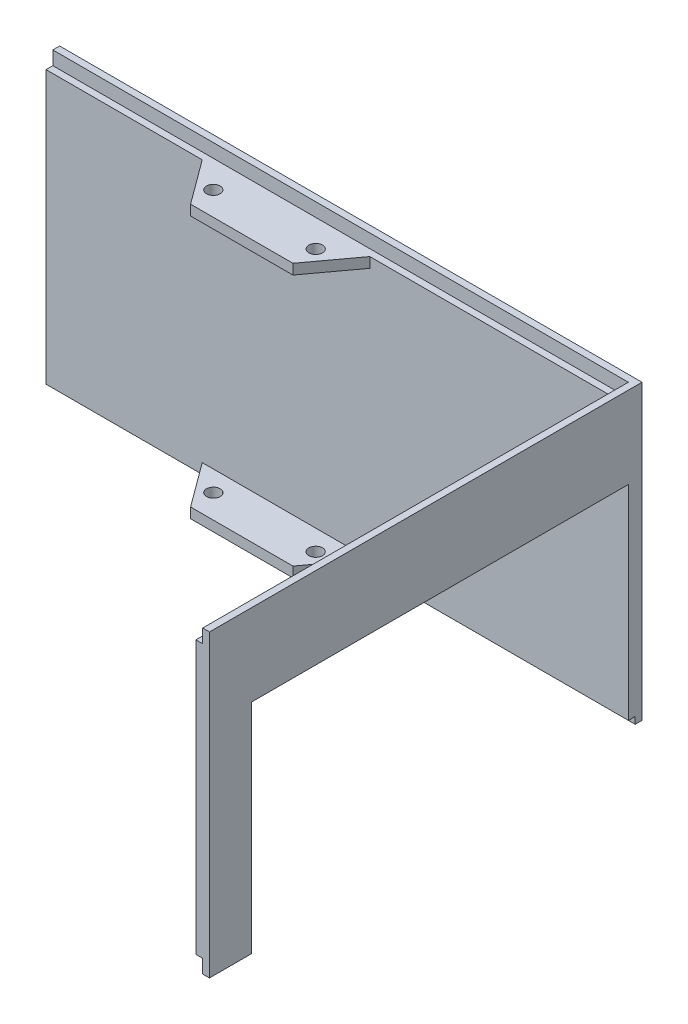
ISO-10303-21;
HEADER;
FILE_DESCRIPTION(('STEP AP214'),'2;1');
FILE_NAME('part.step','',(''),(''),'','','');
FILE_SCHEMA(('AUTOMOTIVE_DESIGN { 1 0 10303 214 1 1 1 1 }'));
ENDSEC;
DATA;
#1=APPLICATION_CONTEXT('core data for automotive mechanical design processes');
#2=APPLICATION_PROTOCOL_DEFINITION('international standard','automotive_design',2000,#1);
#3=PRODUCT_CONTEXT('',#1,'mechanical');
#4=PRODUCT('Part','Part','',(#3));
#5=PRODUCT_RELATED_PRODUCT_CATEGORY('part','',(#4));
#6=PRODUCT_DEFINITION_FORMATION('','',#4);
#7=PRODUCT_DEFINITION_CONTEXT('part definition',#1,'design');
#8=PRODUCT_DEFINITION('design','',#6,#7);
#9=PRODUCT_DEFINITION_SHAPE('','',#8);
#10=(LENGTH_UNIT() NAMED_UNIT(*) SI_UNIT(.MILLI.,.METRE.));
#11=(NAMED_UNIT(*) PLANE_ANGLE_UNIT() SI_UNIT($,.RADIAN.));
#12=(NAMED_UNIT(*) SI_UNIT($,.STERADIAN.) SOLID_ANGLE_UNIT());
#13=UNCERTAINTY_MEASURE_WITH_UNIT(LENGTH_MEASURE(1.E-05),#10,'distance_accuracy_value','');
#14=(GEOMETRIC_REPRESENTATION_CONTEXT(3) GLOBAL_UNCERTAINTY_ASSIGNED_CONTEXT((#13)) GLOBAL_UNIT_ASSIGNED_CONTEXT((#10,
#11,#12)) REPRESENTATION_CONTEXT('',''));
#15=CARTESIAN_POINT('',(0.,0.,0.));
#16=DIRECTION('',(0.,0.,1.));
#17=DIRECTION('',(1.,0.,0.));
#18=AXIS2_PLACEMENT_3D('',#15,#16,#17);
#19=CARTESIAN_POINT('',(0.,0.,4.));
#20=DIRECTION('',(0.,0.,1.));
#21=DIRECTION('',(1.,0.,0.));
#22=AXIS2_PLACEMENT_3D('',#19,#20,#21);
#23=PLANE('',#22);
#24=DIRECTION('',(0.,1.,0.));
#25=VECTOR('',#24,1.);
#26=CARTESIAN_POINT('',(9.57742396503259,36.,4.));
#27=LINE('',#26,#25);
#28=CARTESIAN_POINT('',(9.57742396503259,36.,4.));
#29=VERTEX_POINT('',#28);
#30=CARTESIAN_POINT('',(9.57742396503259,39.,4.));
#31=VERTEX_POINT('',#30);
#32=EDGE_CURVE('E230',#29,#31,#27,.T.);
#33=ORIENTED_EDGE('',*,*,#32,.F.);
#34=DIRECTION('',(-1.,0.,0.));
#35=VECTOR('',#34,1.);
#36=CARTESIAN_POINT('',(0.,36.,4.));
#37=LINE('',#36,#35);
#38=CARTESIAN_POINT('',(-39.6274239650326,36.,4.));
#39=VERTEX_POINT('',#38);
#40=EDGE_CURVE('E215',#29,#39,#37,.T.);
#41=ORIENTED_EDGE('',*,*,#40,.T.);
#42=DIRECTION('',(0.,1.,0.));
#43=VECTOR('',#42,1.);
#44=CARTESIAN_POINT('',(-39.6274239650326,36.,4.));
#45=LINE('',#44,#43);
#46=CARTESIAN_POINT('',(-39.6274239650326,39.,4.));
#47=VERTEX_POINT('',#46);
#48=EDGE_CURVE('E239',#39,#47,#45,.T.);
#49=ORIENTED_EDGE('',*,*,#48,.T.);
#50=DIRECTION('',(1.,0.,0.));
#51=VECTOR('',#50,1.);
#52=CARTESIAN_POINT('',(0.,39.,4.));
#53=LINE('',#52,#51);
#54=CARTESIAN_POINT('',(-85.5,39.,4.));
#55=VERTEX_POINT('',#54);
#56=EDGE_CURVE('E463',#55,#47,#53,.T.);
#57=ORIENTED_EDGE('',*,*,#56,.F.);
#58=DIRECTION('',(0.,1.,0.));
#59=VECTOR('',#58,1.);
#60=CARTESIAN_POINT('',(-85.5,0.,4.));
#61=LINE('',#60,#59);
#62=CARTESIAN_POINT('',(-85.5,-41.,4.));
#63=VERTEX_POINT('',#62);
#64=EDGE_CURVE('E451',#63,#55,#61,.T.);
#65=ORIENTED_EDGE('',*,*,#64,.F.);
#66=DIRECTION('',(1.,0.,0.));
#67=VECTOR('',#66,1.);
#68=CARTESIAN_POINT('',(0.,-41.,4.));
#69=LINE('',#68,#67);
#70=CARTESIAN_POINT('',(-39.6274239650326,-41.,4.));
#71=VERTEX_POINT('',#70);
#72=EDGE_CURVE('E457',#63,#71,#69,.T.);
#73=ORIENTED_EDGE('',*,*,#72,.T.);
#74=DIRECTION('',(0.,-1.,0.));
#75=VECTOR('',#74,1.);
#76=CARTESIAN_POINT('',(-39.6274239650326,-38.,4.));
#77=LINE('',#76,#75);
#78=CARTESIAN_POINT('',(-39.6274239650326,-38.,4.));
#79=VERTEX_POINT('',#78);
#80=EDGE_CURVE('E293',#79,#71,#77,.T.);
#81=ORIENTED_EDGE('',*,*,#80,.F.);
#82=DIRECTION('',(-1.,0.,0.));
#83=VECTOR('',#82,1.);
#84=CARTESIAN_POINT('',(0.,-38.,4.));
#85=LINE('',#84,#83);
#86=CARTESIAN_POINT('',(9.57742396503259,-38.,4.));
#87=VERTEX_POINT('',#86);
#88=EDGE_CURVE('E75',#87,#79,#85,.T.);
#89=ORIENTED_EDGE('',*,*,#88,.F.);
#90=DIRECTION('',(0.,-1.,0.));
#91=VECTOR('',#90,1.);
#92=CARTESIAN_POINT('',(9.57742396503259,-38.,4.));
#93=LINE('',#92,#91);
#94=CARTESIAN_POINT('',(9.57742396503259,-41.,4.));
#95=VERTEX_POINT('',#94);
#96=EDGE_CURVE('E289',#87,#95,#93,.T.);
#97=ORIENTED_EDGE('',*,*,#96,.T.);
#98=CARTESIAN_POINT('',(85.5,-41.,4.));
#99=VERTEX_POINT('',#98);
#100=EDGE_CURVE('E455',#95,#99,#69,.T.);
#101=ORIENTED_EDGE('',*,*,#100,.T.);
#102=DIRECTION('',(0.,1.,0.));
#103=VECTOR('',#102,1.);
#104=CARTESIAN_POINT('',(85.5,0.,4.));
#105=LINE('',#104,#103);
#106=CARTESIAN_POINT('',(85.5,19.,4.));
#107=VERTEX_POINT('',#106);
#108=EDGE_CURVE('E460',#99,#107,#105,.T.);
#109=ORIENTED_EDGE('',*,*,#108,.T.);
#110=DIRECTION('',(1.,0.,0.));
#111=VECTOR('',#110,1.);
#112=CARTESIAN_POINT('',(81.5,19.,4.));
#113=LINE('',#112,#111);
#114=CARTESIAN_POINT('',(81.5,19.,4.));
#115=VERTEX_POINT('',#114);
#116=EDGE_CURVE('E392',#115,#107,#113,.T.);
#117=ORIENTED_EDGE('',*,*,#116,.F.);
#118=DIRECTION('',(0.,-1.,0.));
#119=VECTOR('',#118,1.);
#120=CARTESIAN_POINT('',(81.5,0.,4.));
#121=LINE('',#120,#119);
#122=CARTESIAN_POINT('',(81.5,39.,4.));
#123=VERTEX_POINT('',#122);
#124=EDGE_CURVE('E362',#123,#115,#121,.T.);
#125=ORIENTED_EDGE('',*,*,#124,.F.);
#126=EDGE_CURVE('E237',#31,#123,#53,.T.);
#127=ORIENTED_EDGE('',*,*,#126,.F.);
#128=EDGE_LOOP('',(#33,#41,#49,#57,#65,#73,#81,#89,#97,#101,#109,#117,#125,#127));
#129=FACE_BOUND('',#128,.T.);
#130=ADVANCED_FACE('F51',(#129),#23,.T.);
#131=CARTESIAN_POINT('',(81.5,-41.,0.));
#132=DIRECTION('',(0.,-1.,0.));
#133=DIRECTION('',(0.,0.,-1.));
#134=AXIS2_PLACEMENT_3D('',#131,#132,#133);
#135=PLANE('',#134);
#136=DIRECTION('',(1.,0.,0.));
#137=VECTOR('',#136,1.);
#138=CARTESIAN_POINT('',(81.5,-41.,114.644000153735));
#139=LINE('',#138,#137);
#140=CARTESIAN_POINT('',(81.5,-41.,114.644000153735));
#141=VERTEX_POINT('',#140);
#142=CARTESIAN_POINT('',(83.5,-41.,114.644000153735));
#143=VERTEX_POINT('',#142);
#144=EDGE_CURVE('E373',#141,#143,#139,.T.);
#145=ORIENTED_EDGE('',*,*,#144,.T.);
#146=DIRECTION('',(0.,0.,-1.));
#147=VECTOR('',#146,1.);
#148=CARTESIAN_POINT('',(83.5,-41.,0.));
#149=LINE('',#148,#147);
#150=CARTESIAN_POINT('',(83.5,-41.,127.));
#151=VERTEX_POINT('',#150);
#152=EDGE_CURVE('E314',#151,#143,#149,.T.);
#153=ORIENTED_EDGE('',*,*,#152,.F.);
#154=DIRECTION('',(1.,0.,0.));
#155=VECTOR('',#154,1.);
#156=CARTESIAN_POINT('',(81.5,-41.,127.));
#157=LINE('',#156,#155);
#158=CARTESIAN_POINT('',(81.5,-41.,127.));
#159=VERTEX_POINT('',#158);
#160=EDGE_CURVE('E384',#159,#151,#157,.T.);
#161=ORIENTED_EDGE('',*,*,#160,.F.);
#162=DIRECTION('',(0.,0.,-1.));
#163=VECTOR('',#162,1.);
#164=CARTESIAN_POINT('',(81.5,-41.,0.));
#165=LINE('',#164,#163);
#166=EDGE_CURVE('E349',#159,#141,#165,.T.);
#167=ORIENTED_EDGE('',*,*,#166,.T.);
#168=EDGE_LOOP('',(#145,#153,#161,#167));
#169=FACE_BOUND('',#168,.T.);
#170=ADVANCED_FACE('F566',(#169),#135,.T.);
#171=CARTESIAN_POINT('',(0.,39.,4.));
#172=DIRECTION('',(0.,1.,0.));
#173=DIRECTION('',(0.,0.,1.));
#174=AXIS2_PLACEMENT_3D('',#171,#172,#173);
#175=PLANE('',#174);
#176=CARTESIAN_POINT('',(-0.300000000000009,39.,10.02));
#177=DIRECTION('',(0.,1.,0.));
#178=DIRECTION('',(0.,0.,1.));
#179=AXIS2_PLACEMENT_3D('',#176,#177,#178);
#180=CIRCLE('',#179,2.);
#181=CARTESIAN_POINT('',(-0.300000000000009,39.,12.02));
#182=VERTEX_POINT('',#181);
#183=EDGE_CURVE('E540',#182,#182,#180,.T.);
#184=ORIENTED_EDGE('',*,*,#183,.F.);
#185=EDGE_LOOP('',(#184));
#186=FACE_BOUND('',#185,.T.);
#187=CARTESIAN_POINT('',(-30.35,39.,10.02));
#188=DIRECTION('',(0.,1.,0.));
#189=DIRECTION('',(0.,0.,1.));
#190=AXIS2_PLACEMENT_3D('',#187,#188,#189);
#191=CIRCLE('',#190,2.);
#192=CARTESIAN_POINT('',(-30.35,39.,12.02));
#193=VERTEX_POINT('',#192);
#194=EDGE_CURVE('E548',#193,#193,#191,.T.);
#195=ORIENTED_EDGE('',*,*,#194,.F.);
#196=EDGE_LOOP('',(#195));
#197=FACE_BOUND('',#196,.T.);
#198=DIRECTION('',(1.,0.,0.));
#199=VECTOR('',#198,1.);
#200=CARTESIAN_POINT('',(81.5,39.,127.));
#201=LINE('',#200,#199);
#202=CARTESIAN_POINT('',(81.5,39.,127.));
#203=VERTEX_POINT('',#202);
#204=CARTESIAN_POINT('',(83.5,39.,127.));
#205=VERTEX_POINT('',#204);
#206=EDGE_CURVE('E389',#203,#205,#201,.T.);
#207=ORIENTED_EDGE('',*,*,#206,.T.);
#208=DIRECTION('',(0.,0.,1.));
#209=VECTOR('',#208,1.);
#210=CARTESIAN_POINT('',(83.5,39.,0.));
#211=LINE('',#210,#209);
#212=CARTESIAN_POINT('',(83.5,39.,2.));
#213=VERTEX_POINT('',#212);
#214=EDGE_CURVE('E326',#213,#205,#211,.T.);
#215=ORIENTED_EDGE('',*,*,#214,.F.);
#216=DIRECTION('',(1.,0.,0.));
#217=VECTOR('',#216,1.);
#218=CARTESIAN_POINT('',(0.,39.,2.));
#219=LINE('',#218,#217);
#220=CARTESIAN_POINT('',(-85.5,39.,2.));
#221=VERTEX_POINT('',#220);
#222=EDGE_CURVE('E432',#221,#213,#219,.T.);
#223=ORIENTED_EDGE('',*,*,#222,.F.);
#224=DIRECTION('',(0.,0.,-1.));
#225=VECTOR('',#224,1.);
#226=CARTESIAN_POINT('',(-85.5,39.,4.));
#227=LINE('',#226,#225);
#228=EDGE_CURVE('E467',#55,#221,#227,.T.);
#229=ORIENTED_EDGE('',*,*,#228,.F.);
#230=ORIENTED_EDGE('',*,*,#56,.T.);
#231=DIRECTION('',(-0.59313788951841,0.,-0.805100890583066));
#232=VECTOR('',#231,1.);
#233=CARTESIAN_POINT('',(-27.5961420252574,39.,20.3307655365495));
#234=LINE('',#233,#232);
#235=CARTESIAN_POINT('',(-30.05,39.,17.));
#236=VERTEX_POINT('',#235);
#237=EDGE_CURVE('E536',#236,#47,#234,.T.);
#238=ORIENTED_EDGE('',*,*,#237,.F.);
#239=DIRECTION('',(1.,0.,0.));
#240=VECTOR('',#239,1.);
#241=CARTESIAN_POINT('',(0.,39.,17.));
#242=LINE('',#241,#240);
#243=CARTESIAN_POINT('',(0.,39.,17.));
#244=VERTEX_POINT('',#243);
#245=EDGE_CURVE('E234',#236,#244,#242,.T.);
#246=ORIENTED_EDGE('',*,*,#245,.T.);
#247=DIRECTION('',(0.593137889518411,0.,-0.805100890583065));
#248=VECTOR('',#247,1.);
#249=CARTESIAN_POINT('',(8.11810933252715,39.,5.98081345170003));
#250=LINE('',#249,#248);
#251=EDGE_CURVE('E67',#244,#31,#250,.T.);
#252=ORIENTED_EDGE('',*,*,#251,.T.);
#253=ORIENTED_EDGE('',*,*,#126,.T.);
#254=DIRECTION('',(0.,0.,1.));
#255=VECTOR('',#254,1.);
#256=CARTESIAN_POINT('',(81.5,39.,0.));
#257=LINE('',#256,#255);
#258=EDGE_CURVE('E366',#123,#203,#257,.T.);
#259=ORIENTED_EDGE('',*,*,#258,.T.);
#260=EDGE_LOOP('',(#207,#215,#223,#229,#230,#238,#246,#252,#253,#259));
#261=FACE_BOUND('',#260,.T.);
#262=ADVANCED_FACE('F525',(#186,#197,#261),#175,.T.);
#263=CARTESIAN_POINT('',(0.,0.,2.));
#264=DIRECTION('',(0.,0.,1.));
#265=DIRECTION('',(1.,0.,0.));
#266=AXIS2_PLACEMENT_3D('',#263,#264,#265);
#267=PLANE('',#266);
#268=ORIENTED_EDGE('',*,*,#222,.T.);
#269=DIRECTION('',(0.,-1.,0.));
#270=VECTOR('',#269,1.);
#271=CARTESIAN_POINT('',(83.5,0.,2.));
#272=LINE('',#271,#270);
#273=CARTESIAN_POINT('',(83.5,43.,2.));
#274=VERTEX_POINT('',#273);
#275=EDGE_CURVE('E333',#274,#213,#272,.T.);
#276=ORIENTED_EDGE('',*,*,#275,.F.);
#277=DIRECTION('',(-1.,0.,0.));
#278=VECTOR('',#277,1.);
#279=CARTESIAN_POINT('',(0.,43.,2.));
#280=LINE('',#279,#278);
#281=CARTESIAN_POINT('',(-85.5,43.,2.));
#282=VERTEX_POINT('',#281);
#283=EDGE_CURVE('E436',#274,#282,#280,.T.);
#284=ORIENTED_EDGE('',*,*,#283,.T.);
#285=DIRECTION('',(0.,1.,0.));
#286=VECTOR('',#285,1.);
#287=CARTESIAN_POINT('',(-85.5,0.,2.));
#288=LINE('',#287,#286);
#289=EDGE_CURVE('E428',#221,#282,#288,.T.);
#290=ORIENTED_EDGE('',*,*,#289,.F.);
#291=EDGE_LOOP('',(#268,#276,#284,#290));
#292=FACE_BOUND('',#291,.T.);
#293=ADVANCED_FACE('F565',(#292),#267,.T.);
#294=CARTESIAN_POINT('',(-85.5,0.,4.));
#295=DIRECTION('',(-1.,0.,0.));
#296=DIRECTION('',(0.,0.,1.));
#297=AXIS2_PLACEMENT_3D('',#294,#295,#296);
#298=PLANE('',#297);
#299=DIRECTION('',(0.,1.,0.));
#300=VECTOR('',#299,1.);
#301=CARTESIAN_POINT('',(-85.5,0.,0.));
#302=LINE('',#301,#300);
#303=CARTESIAN_POINT('',(-85.5,-43.,0.));
#304=VERTEX_POINT('',#303);
#305=CARTESIAN_POINT('',(-85.5,43.,0.));
#306=VERTEX_POINT('',#305);
#307=EDGE_CURVE('E450',#304,#306,#302,.T.);
#308=ORIENTED_EDGE('',*,*,#307,.F.);
#309=DIRECTION('',(0.,0.,-1.));
#310=VECTOR('',#309,1.);
#311=CARTESIAN_POINT('',(-85.5,-43.,2.));
#312=LINE('',#311,#310);
#313=CARTESIAN_POINT('',(-85.5,-43.,2.));
#314=VERTEX_POINT('',#313);
#315=EDGE_CURVE('E423',#314,#304,#312,.T.);
#316=ORIENTED_EDGE('',*,*,#315,.F.);
#317=DIRECTION('',(0.,1.,0.));
#318=VECTOR('',#317,1.);
#319=CARTESIAN_POINT('',(-85.5,0.,2.));
#320=LINE('',#319,#318);
#321=CARTESIAN_POINT('',(-85.5,-41.,2.));
#322=VERTEX_POINT('',#321);
#323=EDGE_CURVE('E405',#314,#322,#320,.T.);
#324=ORIENTED_EDGE('',*,*,#323,.T.);
#325=DIRECTION('',(0.,0.,-1.));
#326=VECTOR('',#325,1.);
#327=CARTESIAN_POINT('',(-85.5,-41.,4.));
#328=LINE('',#327,#326);
#329=EDGE_CURVE('E11',#63,#322,#328,.T.);
#330=ORIENTED_EDGE('',*,*,#329,.F.);
#331=ORIENTED_EDGE('',*,*,#64,.T.);
#332=ORIENTED_EDGE('',*,*,#228,.T.);
#333=ORIENTED_EDGE('',*,*,#289,.T.);
#334=DIRECTION('',(0.,0.,-1.));
#335=VECTOR('',#334,1.);
#336=CARTESIAN_POINT('',(-85.5,43.,2.));
#337=LINE('',#336,#335);
#338=EDGE_CURVE('E439',#282,#306,#337,.T.);
#339=ORIENTED_EDGE('',*,*,#338,.T.);
#340=EDGE_LOOP('',(#308,#316,#324,#330,#331,#332,#333,#339));
#341=FACE_BOUND('',#340,.T.);
#342=ADVANCED_FACE('F53',(#341),#298,.T.);
#343=CARTESIAN_POINT('',(0.,-41.,4.));
#344=DIRECTION('',(0.,1.,0.));
#345=DIRECTION('',(0.,0.,1.));
#346=AXIS2_PLACEMENT_3D('',#343,#344,#345);
#347=PLANE('',#346);
#348=CARTESIAN_POINT('',(-0.300000000000009,-41.,10.02));
#349=DIRECTION('',(0.,1.,0.));
#350=DIRECTION('',(0.,0.,1.));
#351=AXIS2_PLACEMENT_3D('',#348,#349,#350);
#352=CIRCLE('',#351,2.);
#353=CARTESIAN_POINT('',(-0.300000000000009,-41.,12.02));
#354=VERTEX_POINT('',#353);
#355=EDGE_CURVE('E249',#354,#354,#352,.T.);
#356=ORIENTED_EDGE('',*,*,#355,.T.);
#357=EDGE_LOOP('',(#356));
#358=FACE_BOUND('',#357,.T.);
#359=CARTESIAN_POINT('',(-30.35,-41.,10.02));
#360=DIRECTION('',(0.,1.,0.));
#361=DIRECTION('',(0.,0.,1.));
#362=AXIS2_PLACEMENT_3D('',#359,#360,#361);
#363=CIRCLE('',#362,2.);
#364=CARTESIAN_POINT('',(-30.35,-41.,12.02));
#365=VERTEX_POINT('',#364);
#366=EDGE_CURVE('E262',#365,#365,#363,.T.);
#367=ORIENTED_EDGE('',*,*,#366,.T.);
#368=EDGE_LOOP('',(#367));
#369=FACE_BOUND('',#368,.T.);
#370=ORIENTED_EDGE('',*,*,#329,.T.);
#371=DIRECTION('',(1.,0.,0.));
#372=VECTOR('',#371,1.);
#373=CARTESIAN_POINT('',(0.,-41.,2.));
#374=LINE('',#373,#372);
#375=CARTESIAN_POINT('',(85.5,-41.,2.));
#376=VERTEX_POINT('',#375);
#377=EDGE_CURVE('E401',#322,#376,#374,.T.);
#378=ORIENTED_EDGE('',*,*,#377,.T.);
#379=DIRECTION('',(0.,0.,-1.));
#380=VECTOR('',#379,1.);
#381=CARTESIAN_POINT('',(85.5,-41.,4.));
#382=LINE('',#381,#380);
#383=EDGE_CURVE('E60',#99,#376,#382,.T.);
#384=ORIENTED_EDGE('',*,*,#383,.F.);
#385=ORIENTED_EDGE('',*,*,#100,.F.);
#386=DIRECTION('',(0.593137889518411,0.,-0.805100890583065));
#387=VECTOR('',#386,1.);
#388=CARTESIAN_POINT('',(8.11810933252715,-41.,5.98081345170003));
#389=LINE('',#388,#387);
#390=CARTESIAN_POINT('',(0.,-41.,17.));
#391=VERTEX_POINT('',#390);
#392=EDGE_CURVE('E253',#391,#95,#389,.T.);
#393=ORIENTED_EDGE('',*,*,#392,.F.);
#394=DIRECTION('',(1.,0.,0.));
#395=VECTOR('',#394,1.);
#396=CARTESIAN_POINT('',(0.,-41.,17.));
#397=LINE('',#396,#395);
#398=CARTESIAN_POINT('',(-30.05,-41.,17.));
#399=VERTEX_POINT('',#398);
#400=EDGE_CURVE('E283',#399,#391,#397,.T.);
#401=ORIENTED_EDGE('',*,*,#400,.F.);
#402=DIRECTION('',(-0.59313788951841,0.,-0.805100890583066));
#403=VECTOR('',#402,1.);
#404=CARTESIAN_POINT('',(-27.5961420252574,-41.,20.3307655365495));
#405=LINE('',#404,#403);
#406=EDGE_CURVE('E270',#399,#71,#405,.T.);
#407=ORIENTED_EDGE('',*,*,#406,.T.);
#408=ORIENTED_EDGE('',*,*,#72,.F.);
#409=EDGE_LOOP('',(#370,#378,#384,#385,#393,#401,#407,#408));
#410=FACE_BOUND('',#409,.T.);
#411=ADVANCED_FACE('F483',(#358,#369,#410),#347,.F.);
#412=CARTESIAN_POINT('',(85.5,0.,4.));
#413=DIRECTION('',(-1.,0.,0.));
#414=DIRECTION('',(0.,0.,1.));
#415=AXIS2_PLACEMENT_3D('',#412,#413,#414);
#416=PLANE('',#415);
#417=DIRECTION('',(0.,1.,0.));
#418=VECTOR('',#417,1.);
#419=CARTESIAN_POINT('',(85.5,0.,0.));
#420=LINE('',#419,#418);
#421=CARTESIAN_POINT('',(85.5,-43.,0.));
#422=VERTEX_POINT('',#421);
#423=CARTESIAN_POINT('',(85.5,43.,0.));
#424=VERTEX_POINT('',#423);
#425=EDGE_CURVE('E456',#422,#424,#420,.T.);
#426=ORIENTED_EDGE('',*,*,#425,.T.);
#427=DIRECTION('',(0.,0.,-1.));
#428=VECTOR('',#427,1.);
#429=CARTESIAN_POINT('',(85.5,43.,2.));
#430=LINE('',#429,#428);
#431=CARTESIAN_POINT('',(85.5,43.,127.));
#432=VERTEX_POINT('',#431);
#433=EDGE_CURVE('E446',#432,#424,#430,.T.);
#434=ORIENTED_EDGE('',*,*,#433,.F.);
#435=DIRECTION('',(0.,1.,0.));
#436=VECTOR('',#435,1.);
#437=CARTESIAN_POINT('',(85.5,0.,127.));
#438=LINE('',#437,#436);
#439=CARTESIAN_POINT('',(85.5,-45.,127.));
#440=VERTEX_POINT('',#439);
#441=EDGE_CURVE('E354',#440,#432,#438,.T.);
#442=ORIENTED_EDGE('',*,*,#441,.F.);
#443=DIRECTION('',(0.,0.,1.));
#444=VECTOR('',#443,1.);
#445=CARTESIAN_POINT('',(85.5,-45.,0.));
#446=LINE('',#445,#444);
#447=CARTESIAN_POINT('',(85.5,-45.,114.644000153735));
#448=VERTEX_POINT('',#447);
#449=EDGE_CURVE('E292',#448,#440,#446,.T.);
#450=ORIENTED_EDGE('',*,*,#449,.F.);
#451=DIRECTION('',(0.,1.,0.));
#452=VECTOR('',#451,1.);
#453=CARTESIAN_POINT('',(85.5,0.,114.644000153735));
#454=LINE('',#453,#452);
#455=CARTESIAN_POINT('',(85.5,19.,114.644000153735));
#456=VERTEX_POINT('',#455);
#457=EDGE_CURVE('E348',#448,#456,#454,.T.);
#458=ORIENTED_EDGE('',*,*,#457,.T.);
#459=DIRECTION('',(0.,0.,-1.));
#460=VECTOR('',#459,1.);
#461=CARTESIAN_POINT('',(85.5,19.,0.));
#462=LINE('',#461,#460);
#463=EDGE_CURVE('E377',#456,#107,#462,.T.);
#464=ORIENTED_EDGE('',*,*,#463,.T.);
#465=ORIENTED_EDGE('',*,*,#108,.F.);
#466=ORIENTED_EDGE('',*,*,#383,.T.);
#467=DIRECTION('',(0.,1.,0.));
#468=VECTOR('',#467,1.);
#469=CARTESIAN_POINT('',(85.5,0.,2.));
#470=LINE('',#469,#468);
#471=CARTESIAN_POINT('',(85.5,-43.,2.));
#472=VERTEX_POINT('',#471);
#473=EDGE_CURVE('E413',#472,#376,#470,.T.);
#474=ORIENTED_EDGE('',*,*,#473,.F.);
#475=DIRECTION('',(0.,0.,-1.));
#476=VECTOR('',#475,1.);
#477=CARTESIAN_POINT('',(85.5,-43.,2.));
#478=LINE('',#477,#476);
#479=EDGE_CURVE('E416',#472,#422,#478,.T.);
#480=ORIENTED_EDGE('',*,*,#479,.T.);
#481=EDGE_LOOP('',(#426,#434,#442,#450,#458,#464,#465,#466,#474,#480));
#482=FACE_BOUND('',#481,.T.);
#483=ADVANCED_FACE('F480',(#482),#416,.F.);
#484=CARTESIAN_POINT('',(0.,0.,0.));
#485=DIRECTION('',(0.,0.,1.));
#486=DIRECTION('',(1.,0.,0.));
#487=AXIS2_PLACEMENT_3D('',#484,#485,#486);
#488=PLANE('',#487);
#489=ORIENTED_EDGE('',*,*,#307,.T.);
#490=DIRECTION('',(-1.,0.,0.));
#491=VECTOR('',#490,1.);
#492=CARTESIAN_POINT('',(0.,43.,0.));
#493=LINE('',#492,#491);
#494=EDGE_CURVE('E427',#424,#306,#493,.T.);
#495=ORIENTED_EDGE('',*,*,#494,.F.);
#496=ORIENTED_EDGE('',*,*,#425,.F.);
#497=DIRECTION('',(-1.,0.,0.));
#498=VECTOR('',#497,1.);
#499=CARTESIAN_POINT('',(0.,-43.,0.));
#500=LINE('',#499,#498);
#501=EDGE_CURVE('E388',#422,#304,#500,.T.);
#502=ORIENTED_EDGE('',*,*,#501,.T.);
#503=EDGE_LOOP('',(#489,#495,#496,#502));
#504=FACE_BOUND('',#503,.T.);
#505=ADVANCED_FACE('F494',(#504),#488,.F.);
#506=CARTESIAN_POINT('',(0.,43.,2.));
#507=DIRECTION('',(0.,-1.,0.));
#508=DIRECTION('',(1.,0.,0.));
#509=AXIS2_PLACEMENT_3D('',#506,#507,#508);
#510=PLANE('',#509);
#511=ORIENTED_EDGE('',*,*,#494,.T.);
#512=ORIENTED_EDGE('',*,*,#338,.F.);
#513=ORIENTED_EDGE('',*,*,#283,.F.);
#514=DIRECTION('',(0.,0.,-1.));
#515=VECTOR('',#514,1.);
#516=CARTESIAN_POINT('',(83.5,43.,0.));
#517=LINE('',#516,#515);
#518=CARTESIAN_POINT('',(83.5,43.,127.));
#519=VERTEX_POINT('',#518);
#520=EDGE_CURVE('E337',#519,#274,#517,.T.);
#521=ORIENTED_EDGE('',*,*,#520,.F.);
#522=DIRECTION('',(1.,0.,0.));
#523=VECTOR('',#522,1.);
#524=CARTESIAN_POINT('',(83.5,43.,127.));
#525=LINE('',#524,#523);
#526=EDGE_CURVE('E344',#519,#432,#525,.T.);
#527=ORIENTED_EDGE('',*,*,#526,.T.);
#528=ORIENTED_EDGE('',*,*,#433,.T.);
#529=EDGE_LOOP('',(#511,#512,#513,#521,#527,#528));
#530=FACE_BOUND('',#529,.T.);
#531=ADVANCED_FACE('F497',(#530),#510,.F.);
#532=CARTESIAN_POINT('',(0.,-43.,2.));
#533=DIRECTION('',(0.,-1.,0.));
#534=DIRECTION('',(1.,0.,0.));
#535=AXIS2_PLACEMENT_3D('',#532,#533,#534);
#536=PLANE('',#535);
#537=ORIENTED_EDGE('',*,*,#501,.F.);
#538=ORIENTED_EDGE('',*,*,#479,.F.);
#539=DIRECTION('',(-1.,0.,0.));
#540=VECTOR('',#539,1.);
#541=CARTESIAN_POINT('',(0.,-43.,2.));
#542=LINE('',#541,#540);
#543=EDGE_CURVE('E409',#472,#314,#542,.T.);
#544=ORIENTED_EDGE('',*,*,#543,.T.);
#545=ORIENTED_EDGE('',*,*,#315,.T.);
#546=EDGE_LOOP('',(#537,#538,#544,#545));
#547=FACE_BOUND('',#546,.T.);
#548=ADVANCED_FACE('F492',(#547),#536,.T.);
#549=CARTESIAN_POINT('',(0.,0.,2.));
#550=DIRECTION('',(0.,0.,1.));
#551=DIRECTION('',(1.,0.,0.));
#552=AXIS2_PLACEMENT_3D('',#549,#550,#551);
#553=PLANE('',#552);
#554=ORIENTED_EDGE('',*,*,#377,.F.);
#555=ORIENTED_EDGE('',*,*,#323,.F.);
#556=ORIENTED_EDGE('',*,*,#543,.F.);
#557=ORIENTED_EDGE('',*,*,#473,.T.);
#558=EDGE_LOOP('',(#554,#555,#556,#557));
#559=FACE_BOUND('',#558,.T.);
#560=ADVANCED_FACE('F488',(#559),#553,.T.);
#561=CARTESIAN_POINT('',(81.5,0.,127.));
#562=DIRECTION('',(0.,0.,-1.));
#563=DIRECTION('',(-1.,0.,0.));
#564=AXIS2_PLACEMENT_3D('',#561,#562,#563);
#565=PLANE('',#564);
#566=ORIENTED_EDGE('',*,*,#441,.T.);
#567=ORIENTED_EDGE('',*,*,#526,.F.);
#568=DIRECTION('',(0.,1.,0.));
#569=VECTOR('',#568,1.);
#570=CARTESIAN_POINT('',(83.5,0.,127.));
#571=LINE('',#570,#569);
#572=EDGE_CURVE('E341',#205,#519,#571,.T.);
#573=ORIENTED_EDGE('',*,*,#572,.F.);
#574=ORIENTED_EDGE('',*,*,#206,.F.);
#575=DIRECTION('',(0.,1.,0.));
#576=VECTOR('',#575,1.);
#577=CARTESIAN_POINT('',(81.5,0.,127.));
#578=LINE('',#577,#576);
#579=EDGE_CURVE('E370',#159,#203,#578,.T.);
#580=ORIENTED_EDGE('',*,*,#579,.F.);
#581=ORIENTED_EDGE('',*,*,#160,.T.);
#582=DIRECTION('',(0.,1.,0.));
#583=VECTOR('',#582,1.);
#584=CARTESIAN_POINT('',(83.5,0.,127.));
#585=LINE('',#584,#583);
#586=CARTESIAN_POINT('',(83.5,-45.,127.));
#587=VERTEX_POINT('',#586);
#588=EDGE_CURVE('E303',#587,#151,#585,.T.);
#589=ORIENTED_EDGE('',*,*,#588,.F.);
#590=DIRECTION('',(1.,0.,0.));
#591=VECTOR('',#590,1.);
#592=CARTESIAN_POINT('',(83.5,-45.,127.));
#593=LINE('',#592,#591);
#594=EDGE_CURVE('E318',#587,#440,#593,.T.);
#595=ORIENTED_EDGE('',*,*,#594,.T.);
#596=EDGE_LOOP('',(#566,#567,#573,#574,#580,#581,#589,#595));
#597=FACE_BOUND('',#596,.T.);
#598=ADVANCED_FACE('F504',(#597),#565,.F.);
#599=CARTESIAN_POINT('',(81.5,19.,0.));
#600=DIRECTION('',(0.,-1.,0.));
#601=DIRECTION('',(0.,0.,-1.));
#602=AXIS2_PLACEMENT_3D('',#599,#600,#601);
#603=PLANE('',#602);
#604=ORIENTED_EDGE('',*,*,#463,.F.);
#605=DIRECTION('',(1.,0.,0.));
#606=VECTOR('',#605,1.);
#607=CARTESIAN_POINT('',(81.5,19.,114.644000153735));
#608=LINE('',#607,#606);
#609=CARTESIAN_POINT('',(81.5,19.,114.644000153735));
#610=VERTEX_POINT('',#609);
#611=EDGE_CURVE('E396',#610,#456,#608,.T.);
#612=ORIENTED_EDGE('',*,*,#611,.F.);
#613=DIRECTION('',(0.,0.,-1.));
#614=VECTOR('',#613,1.);
#615=CARTESIAN_POINT('',(81.5,19.,0.));
#616=LINE('',#615,#614);
#617=EDGE_CURVE('E358',#610,#115,#616,.T.);
#618=ORIENTED_EDGE('',*,*,#617,.T.);
#619=ORIENTED_EDGE('',*,*,#116,.T.);
#620=EDGE_LOOP('',(#604,#612,#618,#619));
#621=FACE_BOUND('',#620,.T.);
#622=ADVANCED_FACE('F517',(#621),#603,.T.);
#623=CARTESIAN_POINT('',(81.5,0.,114.644000153735));
#624=DIRECTION('',(0.,0.,-1.));
#625=DIRECTION('',(-1.,0.,0.));
#626=AXIS2_PLACEMENT_3D('',#623,#624,#625);
#627=PLANE('',#626);
#628=ORIENTED_EDGE('',*,*,#457,.F.);
#629=DIRECTION('',(1.,0.,0.));
#630=VECTOR('',#629,1.);
#631=CARTESIAN_POINT('',(83.5,-45.,114.644000153735));
#632=LINE('',#631,#630);
#633=CARTESIAN_POINT('',(83.5,-45.,114.644000153735));
#634=VERTEX_POINT('',#633);
#635=EDGE_CURVE('E322',#634,#448,#632,.T.);
#636=ORIENTED_EDGE('',*,*,#635,.F.);
#637=DIRECTION('',(0.,1.,0.));
#638=VECTOR('',#637,1.);
#639=CARTESIAN_POINT('',(83.5,0.,114.644000153735));
#640=LINE('',#639,#638);
#641=EDGE_CURVE('E310',#634,#143,#640,.T.);
#642=ORIENTED_EDGE('',*,*,#641,.T.);
#643=ORIENTED_EDGE('',*,*,#144,.F.);
#644=DIRECTION('',(0.,1.,0.));
#645=VECTOR('',#644,1.);
#646=CARTESIAN_POINT('',(81.5,0.,114.644000153735));
#647=LINE('',#646,#645);
#648=EDGE_CURVE('E353',#141,#610,#647,.T.);
#649=ORIENTED_EDGE('',*,*,#648,.T.);
#650=ORIENTED_EDGE('',*,*,#611,.T.);
#651=EDGE_LOOP('',(#628,#636,#642,#643,#649,#650));
#652=FACE_BOUND('',#651,.T.);
#653=ADVANCED_FACE('F514',(#652),#627,.T.);
#654=CARTESIAN_POINT('',(81.5,0.,0.));
#655=DIRECTION('',(1.,0.,0.));
#656=DIRECTION('',(0.,0.,-1.));
#657=AXIS2_PLACEMENT_3D('',#654,#655,#656);
#658=PLANE('',#657);
#659=ORIENTED_EDGE('',*,*,#166,.F.);
#660=ORIENTED_EDGE('',*,*,#579,.T.);
#661=ORIENTED_EDGE('',*,*,#258,.F.);
#662=ORIENTED_EDGE('',*,*,#124,.T.);
#663=ORIENTED_EDGE('',*,*,#617,.F.);
#664=ORIENTED_EDGE('',*,*,#648,.F.);
#665=EDGE_LOOP('',(#659,#660,#661,#662,#663,#664));
#666=FACE_BOUND('',#665,.T.);
#667=ADVANCED_FACE('F522',(#666),#658,.F.);
#668=CARTESIAN_POINT('',(83.5,0.,0.));
#669=DIRECTION('',(1.,0.,0.));
#670=DIRECTION('',(0.,0.,-1.));
#671=AXIS2_PLACEMENT_3D('',#668,#669,#670);
#672=PLANE('',#671);
#673=ORIENTED_EDGE('',*,*,#214,.T.);
#674=ORIENTED_EDGE('',*,*,#572,.T.);
#675=ORIENTED_EDGE('',*,*,#520,.T.);
#676=ORIENTED_EDGE('',*,*,#275,.T.);
#677=EDGE_LOOP('',(#673,#674,#675,#676));
#678=FACE_BOUND('',#677,.T.);
#679=ADVANCED_FACE('F640',(#678),#672,.F.);
#680=CARTESIAN_POINT('',(83.5,-45.,0.));
#681=DIRECTION('',(0.,1.,0.));
#682=DIRECTION('',(0.,0.,1.));
#683=AXIS2_PLACEMENT_3D('',#680,#681,#682);
#684=PLANE('',#683);
#685=ORIENTED_EDGE('',*,*,#449,.T.);
#686=ORIENTED_EDGE('',*,*,#594,.F.);
#687=DIRECTION('',(0.,0.,1.));
#688=VECTOR('',#687,1.);
#689=CARTESIAN_POINT('',(83.5,-45.,0.));
#690=LINE('',#689,#688);
#691=EDGE_CURVE('E307',#634,#587,#690,.T.);
#692=ORIENTED_EDGE('',*,*,#691,.F.);
#693=ORIENTED_EDGE('',*,*,#635,.T.);
#694=EDGE_LOOP('',(#685,#686,#692,#693));
#695=FACE_BOUND('',#694,.T.);
#696=ADVANCED_FACE('F510',(#695),#684,.F.);
#697=CARTESIAN_POINT('',(83.5,0.,0.));
#698=DIRECTION('',(1.,0.,0.));
#699=DIRECTION('',(0.,0.,-1.));
#700=AXIS2_PLACEMENT_3D('',#697,#698,#699);
#701=PLANE('',#700);
#702=ORIENTED_EDGE('',*,*,#588,.T.);
#703=ORIENTED_EDGE('',*,*,#152,.T.);
#704=ORIENTED_EDGE('',*,*,#641,.F.);
#705=ORIENTED_EDGE('',*,*,#691,.T.);
#706=EDGE_LOOP('',(#702,#703,#704,#705));
#707=FACE_BOUND('',#706,.T.);
#708=ADVANCED_FACE('F647',(#707),#701,.F.);
#709=CARTESIAN_POINT('',(8.11810933252715,-38.,5.98081345170003));
#710=DIRECTION('',(-0.805100890583065,0.,-0.593137889518411));
#711=DIRECTION('',(-0.593137889518411,0.,0.805100890583066));
#712=AXIS2_PLACEMENT_3D('',#709,#710,#711);
#713=PLANE('',#712);
#714=ORIENTED_EDGE('',*,*,#392,.T.);
#715=ORIENTED_EDGE('',*,*,#96,.F.);
#716=DIRECTION('',(0.593137889518411,0.,-0.805100890583065));
#717=VECTOR('',#716,1.);
#718=CARTESIAN_POINT('',(8.11810933252715,-38.,5.98081345170003));
#719=LINE('',#718,#717);
#720=CARTESIAN_POINT('',(0.,-38.,17.));
#721=VERTEX_POINT('',#720);
#722=EDGE_CURVE('E266',#721,#87,#719,.T.);
#723=ORIENTED_EDGE('',*,*,#722,.F.);
#724=DIRECTION('',(0.,-1.,0.));
#725=VECTOR('',#724,1.);
#726=CARTESIAN_POINT('',(0.,-38.,17.));
#727=LINE('',#726,#725);
#728=EDGE_CURVE('E279',#721,#391,#727,.T.);
#729=ORIENTED_EDGE('',*,*,#728,.T.);
#730=EDGE_LOOP('',(#714,#715,#723,#729));
#731=FACE_BOUND('',#730,.T.);
#732=ADVANCED_FACE('F629',(#731),#713,.F.);
#733=CARTESIAN_POINT('',(-27.5961420252574,-38.,20.3307655365495));
#734=DIRECTION('',(-0.805100890583066,0.,0.59313788951841));
#735=DIRECTION('',(0.59313788951841,0.,0.805100890583066));
#736=AXIS2_PLACEMENT_3D('',#733,#734,#735);
#737=PLANE('',#736);
#738=ORIENTED_EDGE('',*,*,#406,.F.);
#739=DIRECTION('',(0.,-1.,0.));
#740=VECTOR('',#739,1.);
#741=CARTESIAN_POINT('',(-30.05,-38.,17.));
#742=LINE('',#741,#740);
#743=CARTESIAN_POINT('',(-30.05,-38.,17.));
#744=VERTEX_POINT('',#743);
#745=EDGE_CURVE('E297',#744,#399,#742,.T.);
#746=ORIENTED_EDGE('',*,*,#745,.F.);
#747=DIRECTION('',(-0.59313788951841,0.,-0.805100890583066));
#748=VECTOR('',#747,1.);
#749=CARTESIAN_POINT('',(-27.5961420252574,-38.,20.3307655365495));
#750=LINE('',#749,#748);
#751=EDGE_CURVE('E273',#744,#79,#750,.T.);
#752=ORIENTED_EDGE('',*,*,#751,.T.);
#753=ORIENTED_EDGE('',*,*,#80,.T.);
#754=EDGE_LOOP('',(#738,#746,#752,#753));
#755=FACE_BOUND('',#754,.T.);
#756=ADVANCED_FACE('F634',(#755),#737,.T.);
#757=CARTESIAN_POINT('',(0.,-38.,17.));
#758=DIRECTION('',(0.,0.,-1.));
#759=DIRECTION('',(-1.,0.,0.));
#760=AXIS2_PLACEMENT_3D('',#757,#758,#759);
#761=PLANE('',#760);
#762=ORIENTED_EDGE('',*,*,#400,.T.);
#763=ORIENTED_EDGE('',*,*,#728,.F.);
#764=DIRECTION('',(1.,0.,0.));
#765=VECTOR('',#764,1.);
#766=CARTESIAN_POINT('',(0.,-38.,17.));
#767=LINE('',#766,#765);
#768=EDGE_CURVE('E269',#744,#721,#767,.T.);
#769=ORIENTED_EDGE('',*,*,#768,.F.);
#770=ORIENTED_EDGE('',*,*,#745,.T.);
#771=EDGE_LOOP('',(#762,#763,#769,#770));
#772=FACE_BOUND('',#771,.T.);
#773=ADVANCED_FACE('F620',(#772),#761,.F.);
#774=CARTESIAN_POINT('',(0.,-38.,0.));
#775=DIRECTION('',(0.,-1.,0.));
#776=DIRECTION('',(0.,0.,-1.));
#777=AXIS2_PLACEMENT_3D('',#774,#775,#776);
#778=PLANE('',#777);
#779=CARTESIAN_POINT('',(-0.300000000000009,-38.,10.02));
#780=DIRECTION('',(0.,1.,0.));
#781=DIRECTION('',(0.,0.,1.));
#782=AXIS2_PLACEMENT_3D('',#779,#780,#781);
#783=CIRCLE('',#782,2.);
#784=CARTESIAN_POINT('',(-0.300000000000009,-38.,12.02));
#785=VERTEX_POINT('',#784);
#786=EDGE_CURVE('E254',#785,#785,#783,.T.);
#787=ORIENTED_EDGE('',*,*,#786,.F.);
#788=EDGE_LOOP('',(#787));
#789=FACE_BOUND('',#788,.T.);
#790=CARTESIAN_POINT('',(-30.35,-38.,10.02));
#791=DIRECTION('',(0.,1.,0.));
#792=DIRECTION('',(0.,0.,1.));
#793=AXIS2_PLACEMENT_3D('',#790,#791,#792);
#794=CIRCLE('',#793,2.);
#795=CARTESIAN_POINT('',(-30.35,-38.,12.02));
#796=VERTEX_POINT('',#795);
#797=EDGE_CURVE('E258',#796,#796,#794,.T.);
#798=ORIENTED_EDGE('',*,*,#797,.F.);
#799=EDGE_LOOP('',(#798));
#800=FACE_BOUND('',#799,.T.);
#801=ORIENTED_EDGE('',*,*,#722,.T.);
#802=ORIENTED_EDGE('',*,*,#88,.T.);
#803=ORIENTED_EDGE('',*,*,#751,.F.);
#804=ORIENTED_EDGE('',*,*,#768,.T.);
#805=EDGE_LOOP('',(#801,#802,#803,#804));
#806=FACE_BOUND('',#805,.T.);
#807=ADVANCED_FACE('F615',(#789,#800,#806),#778,.F.);
#808=CARTESIAN_POINT('',(-30.35,-41.,10.02));
#809=DIRECTION('',(0.,1.,0.));
#810=DIRECTION('',(0.,0.,1.));
#811=AXIS2_PLACEMENT_3D('',#808,#809,#810);
#812=CYLINDRICAL_SURFACE('',#811,2.);
#813=ORIENTED_EDGE('',*,*,#366,.F.);
#814=EDGE_LOOP('',(#813));
#815=FACE_BOUND('',#814,.T.);
#816=ORIENTED_EDGE('',*,*,#797,.T.);
#817=EDGE_LOOP('',(#816));
#818=FACE_BOUND('',#817,.T.);
#819=ADVANCED_FACE('F611',(#815,#818),#812,.F.);
#820=CARTESIAN_POINT('',(-0.300000000000009,-41.,10.02));
#821=DIRECTION('',(0.,1.,0.));
#822=DIRECTION('',(0.,0.,1.));
#823=AXIS2_PLACEMENT_3D('',#820,#821,#822);
#824=CYLINDRICAL_SURFACE('',#823,2.);
#825=ORIENTED_EDGE('',*,*,#355,.F.);
#826=EDGE_LOOP('',(#825));
#827=FACE_BOUND('',#826,.T.);
#828=ORIENTED_EDGE('',*,*,#786,.T.);
#829=EDGE_LOOP('',(#828));
#830=FACE_BOUND('',#829,.T.);
#831=ADVANCED_FACE('F614',(#827,#830),#824,.F.);
#832=CARTESIAN_POINT('',(8.11810933252715,36.,5.98081345170003));
#833=DIRECTION('',(0.805100890583065,0.,0.593137889518411));
#834=DIRECTION('',(0.593137889518411,0.,-0.805100890583066));
#835=AXIS2_PLACEMENT_3D('',#832,#833,#834);
#836=PLANE('',#835);
#837=ORIENTED_EDGE('',*,*,#251,.F.);
#838=DIRECTION('',(0.,1.,0.));
#839=VECTOR('',#838,1.);
#840=CARTESIAN_POINT('',(0.,36.,17.));
#841=LINE('',#840,#839);
#842=CARTESIAN_POINT('',(0.,36.,17.));
#843=VERTEX_POINT('',#842);
#844=EDGE_CURVE('E232',#843,#244,#841,.T.);
#845=ORIENTED_EDGE('',*,*,#844,.F.);
#846=DIRECTION('',(0.593137889518411,0.,-0.805100890583065));
#847=VECTOR('',#846,1.);
#848=CARTESIAN_POINT('',(8.11810933252715,36.,5.98081345170003));
#849=LINE('',#848,#847);
#850=EDGE_CURVE('E219',#843,#29,#849,.T.);
#851=ORIENTED_EDGE('',*,*,#850,.T.);
#852=ORIENTED_EDGE('',*,*,#32,.T.);
#853=EDGE_LOOP('',(#837,#845,#851,#852));
#854=FACE_BOUND('',#853,.T.);
#855=ADVANCED_FACE('F229',(#854),#836,.T.);
#856=CARTESIAN_POINT('',(0.,36.,17.));
#857=DIRECTION('',(0.,0.,1.));
#858=DIRECTION('',(1.,0.,0.));
#859=AXIS2_PLACEMENT_3D('',#856,#857,#858);
#860=PLANE('',#859);
#861=ORIENTED_EDGE('',*,*,#245,.F.);
#862=DIRECTION('',(0.,1.,0.));
#863=VECTOR('',#862,1.);
#864=CARTESIAN_POINT('',(-30.05,36.,17.));
#865=LINE('',#864,#863);
#866=CARTESIAN_POINT('',(-30.05,36.,17.));
#867=VERTEX_POINT('',#866);
#868=EDGE_CURVE('E244',#867,#236,#865,.T.);
#869=ORIENTED_EDGE('',*,*,#868,.F.);
#870=DIRECTION('',(1.,0.,0.));
#871=VECTOR('',#870,1.);
#872=CARTESIAN_POINT('',(0.,36.,17.));
#873=LINE('',#872,#871);
#874=EDGE_CURVE('E240',#867,#843,#873,.T.);
#875=ORIENTED_EDGE('',*,*,#874,.T.);
#876=ORIENTED_EDGE('',*,*,#844,.T.);
#877=EDGE_LOOP('',(#861,#869,#875,#876));
#878=FACE_BOUND('',#877,.T.);
#879=ADVANCED_FACE('F583',(#878),#860,.T.);
#880=CARTESIAN_POINT('',(-27.5961420252574,36.,20.3307655365495));
#881=DIRECTION('',(0.805100890583066,0.,-0.59313788951841));
#882=DIRECTION('',(-0.59313788951841,0.,-0.805100890583066));
#883=AXIS2_PLACEMENT_3D('',#880,#881,#882);
#884=PLANE('',#883);
#885=ORIENTED_EDGE('',*,*,#237,.T.);
#886=ORIENTED_EDGE('',*,*,#48,.F.);
#887=DIRECTION('',(-0.59313788951841,0.,-0.805100890583066));
#888=VECTOR('',#887,1.);
#889=CARTESIAN_POINT('',(-27.5961420252574,36.,20.3307655365495));
#890=LINE('',#889,#888);
#891=EDGE_CURVE('E222',#867,#39,#890,.T.);
#892=ORIENTED_EDGE('',*,*,#891,.F.);
#893=ORIENTED_EDGE('',*,*,#868,.T.);
#894=EDGE_LOOP('',(#885,#886,#892,#893));
#895=FACE_BOUND('',#894,.T.);
#896=ADVANCED_FACE('F577',(#895),#884,.F.);
#897=CARTESIAN_POINT('',(0.,36.,0.));
#898=DIRECTION('',(0.,1.,0.));
#899=DIRECTION('',(0.,0.,-1.));
#900=AXIS2_PLACEMENT_3D('',#897,#898,#899);
#901=PLANE('',#900);
#902=CARTESIAN_POINT('',(-0.300000000000009,36.,10.02));
#903=DIRECTION('',(0.,1.,0.));
#904=DIRECTION('',(0.,0.,1.));
#905=AXIS2_PLACEMENT_3D('',#902,#903,#904);
#906=CIRCLE('',#905,2.);
#907=CARTESIAN_POINT('',(-0.300000000000009,36.,12.02));
#908=VERTEX_POINT('',#907);
#909=EDGE_CURVE('E552',#908,#908,#906,.T.);
#910=ORIENTED_EDGE('',*,*,#909,.T.);
#911=EDGE_LOOP('',(#910));
#912=FACE_BOUND('',#911,.T.);
#913=CARTESIAN_POINT('',(-30.35,36.,10.02));
#914=DIRECTION('',(0.,1.,0.));
#915=DIRECTION('',(0.,0.,1.));
#916=AXIS2_PLACEMENT_3D('',#913,#914,#915);
#917=CIRCLE('',#916,2.);
#918=CARTESIAN_POINT('',(-30.35,36.,12.02));
#919=VERTEX_POINT('',#918);
#920=EDGE_CURVE('E544',#919,#919,#917,.T.);
#921=ORIENTED_EDGE('',*,*,#920,.T.);
#922=EDGE_LOOP('',(#921));
#923=FACE_BOUND('',#922,.T.);
#924=ORIENTED_EDGE('',*,*,#850,.F.);
#925=ORIENTED_EDGE('',*,*,#874,.F.);
#926=ORIENTED_EDGE('',*,*,#891,.T.);
#927=ORIENTED_EDGE('',*,*,#40,.F.);
#928=EDGE_LOOP('',(#924,#925,#926,#927));
#929=FACE_BOUND('',#928,.T.);
#930=ADVANCED_FACE('F217',(#912,#923,#929),#901,.F.);
#931=CARTESIAN_POINT('',(-30.35,39.,10.02));
#932=DIRECTION('',(0.,-1.,0.));
#933=DIRECTION('',(0.,0.,-1.));
#934=AXIS2_PLACEMENT_3D('',#931,#932,#933);
#935=CYLINDRICAL_SURFACE('',#934,2.);
#936=ORIENTED_EDGE('',*,*,#194,.T.);
#937=EDGE_LOOP('',(#936));
#938=FACE_BOUND('',#937,.T.);
#939=ORIENTED_EDGE('',*,*,#920,.F.);
#940=EDGE_LOOP('',(#939));
#941=FACE_BOUND('',#940,.T.);
#942=ADVANCED_FACE('F570',(#938,#941),#935,.F.);
#943=CARTESIAN_POINT('',(-0.300000000000009,39.,10.02));
#944=DIRECTION('',(0.,-1.,0.));
#945=DIRECTION('',(0.,0.,-1.));
#946=AXIS2_PLACEMENT_3D('',#943,#944,#945);
#947=CYLINDRICAL_SURFACE('',#946,2.);
#948=ORIENTED_EDGE('',*,*,#183,.T.);
#949=EDGE_LOOP('',(#948));
#950=FACE_BOUND('',#949,.T.);
#951=ORIENTED_EDGE('',*,*,#909,.F.);
#952=EDGE_LOOP('',(#951));
#953=FACE_BOUND('',#952,.T.);
#954=ADVANCED_FACE('F560',(#950,#953),#947,.F.);
#955=CLOSED_SHELL('',(#130,#170,#262,#293,#342,#411,#483,#505,#531,#548,#560,#598,#622,#653,
#667,#679,#696,#708,#732,#756,#773,#807,#819,#831,#855,#879,#896,#930,#942,#954));
#956=MANIFOLD_SOLID_BREP('B2',#955);
#957=ADVANCED_BREP_SHAPE_REPRESENTATION('',(#18,#956),#14);
#958=SHAPE_DEFINITION_REPRESENTATION(#9,#957);
ENDSEC;
END-ISO-10303-21;
